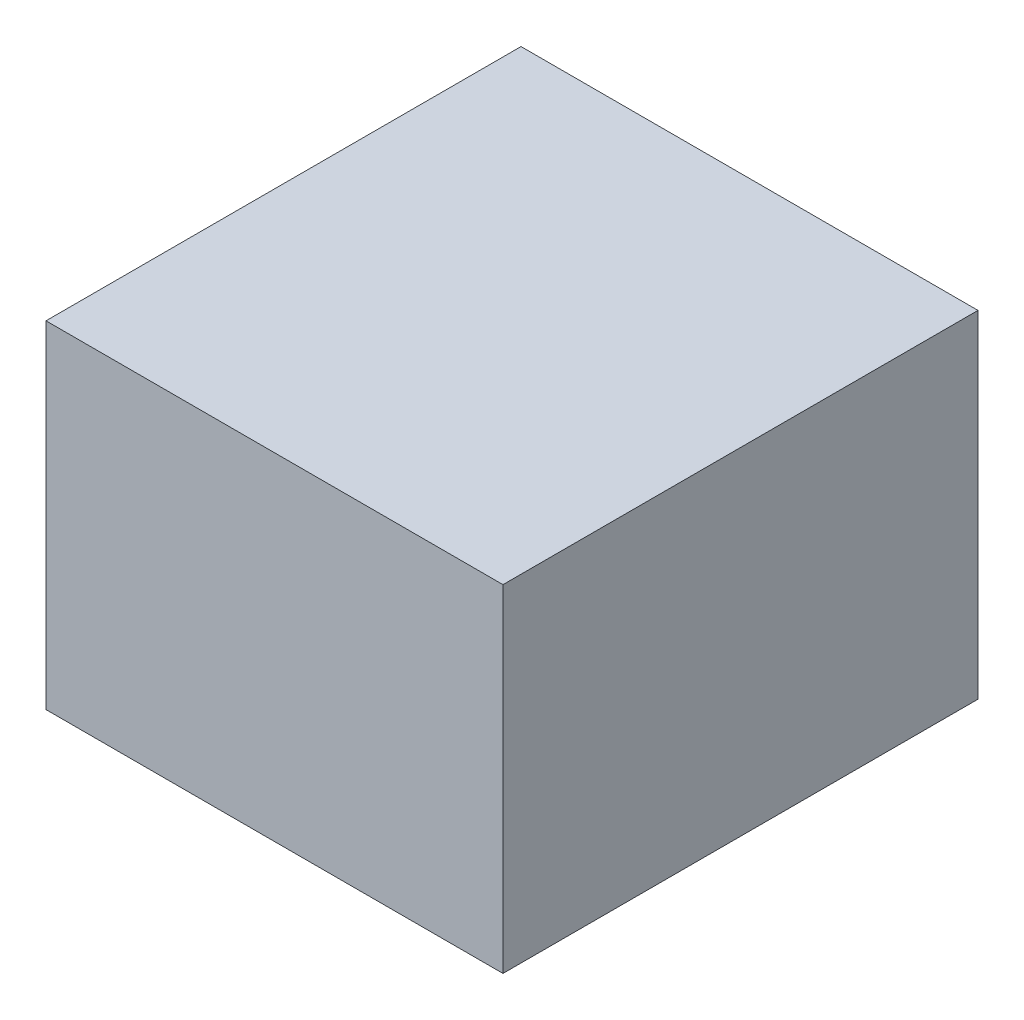
ISO-10303-21;
HEADER;
FILE_DESCRIPTION(('STEP AP214'),'2;1');
FILE_NAME('part.step','',(''),(''),'','','');
FILE_SCHEMA(('AUTOMOTIVE_DESIGN { 1 0 10303 214 1 1 1 1 }'));
ENDSEC;
DATA;
#1=APPLICATION_CONTEXT('core data for automotive mechanical design processes');
#2=APPLICATION_PROTOCOL_DEFINITION('international standard','automotive_design',2000,#1);
#3=PRODUCT_CONTEXT('',#1,'mechanical');
#4=PRODUCT('Part','Part','',(#3));
#5=PRODUCT_RELATED_PRODUCT_CATEGORY('part','',(#4));
#6=PRODUCT_DEFINITION_FORMATION('','',#4);
#7=PRODUCT_DEFINITION_CONTEXT('part definition',#1,'design');
#8=PRODUCT_DEFINITION('design','',#6,#7);
#9=PRODUCT_DEFINITION_SHAPE('','',#8);
#10=(LENGTH_UNIT() NAMED_UNIT(*) SI_UNIT(.MILLI.,.METRE.));
#11=(NAMED_UNIT(*) PLANE_ANGLE_UNIT() SI_UNIT($,.RADIAN.));
#12=(NAMED_UNIT(*) SI_UNIT($,.STERADIAN.) SOLID_ANGLE_UNIT());
#13=UNCERTAINTY_MEASURE_WITH_UNIT(LENGTH_MEASURE(1.E-05),#10,'distance_accuracy_value','');
#14=(GEOMETRIC_REPRESENTATION_CONTEXT(3) GLOBAL_UNCERTAINTY_ASSIGNED_CONTEXT((#13)) GLOBAL_UNIT_ASSIGNED_CONTEXT((#10,
#11,#12)) REPRESENTATION_CONTEXT('',''));
#15=CARTESIAN_POINT('',(0.,0.,0.));
#16=DIRECTION('',(0.,0.,1.));
#17=DIRECTION('',(1.,0.,0.));
#18=AXIS2_PLACEMENT_3D('',#15,#16,#17);
#19=CARTESIAN_POINT('',(3.8,5.6,3.95));
#20=DIRECTION('',(-1.,0.,0.));
#21=DIRECTION('',(0.,0.,1.));
#22=AXIS2_PLACEMENT_3D('',#19,#20,#21);
#23=PLANE('',#22);
#24=DIRECTION('',(0.,0.,-1.));
#25=VECTOR('',#24,1.);
#26=CARTESIAN_POINT('',(3.8,0.,3.95));
#27=LINE('',#26,#25);
#28=CARTESIAN_POINT('',(3.8,0.,3.95));
#29=VERTEX_POINT('',#28);
#30=CARTESIAN_POINT('',(3.8,0.,-3.95));
#31=VERTEX_POINT('',#30);
#32=EDGE_CURVE('E141',#29,#31,#27,.T.);
#33=ORIENTED_EDGE('',*,*,#32,.T.);
#34=DIRECTION('',(0.,-1.,0.));
#35=VECTOR('',#34,1.);
#36=CARTESIAN_POINT('',(3.8,5.6,-3.95));
#37=LINE('',#36,#35);
#38=CARTESIAN_POINT('',(3.8,5.6,-3.95));
#39=VERTEX_POINT('',#38);
#40=EDGE_CURVE('E11',#39,#31,#37,.T.);
#41=ORIENTED_EDGE('',*,*,#40,.F.);
#42=DIRECTION('',(0.,0.,-1.));
#43=VECTOR('',#42,1.);
#44=CARTESIAN_POINT('',(3.8,5.6,3.95));
#45=LINE('',#44,#43);
#46=CARTESIAN_POINT('',(3.8,5.6,3.95));
#47=VERTEX_POINT('',#46);
#48=EDGE_CURVE('E145',#47,#39,#45,.T.);
#49=ORIENTED_EDGE('',*,*,#48,.F.);
#50=DIRECTION('',(0.,-1.,0.));
#51=VECTOR('',#50,1.);
#52=CARTESIAN_POINT('',(3.8,5.6,3.95));
#53=LINE('',#52,#51);
#54=EDGE_CURVE('E151',#47,#29,#53,.T.);
#55=ORIENTED_EDGE('',*,*,#54,.T.);
#56=EDGE_LOOP('',(#33,#41,#49,#55));
#57=FACE_BOUND('',#56,.T.);
#58=ADVANCED_FACE('F33',(#57),#23,.F.);
#59=CARTESIAN_POINT('',(-3.8,5.6,-3.95));
#60=DIRECTION('',(0.,0.,1.));
#61=DIRECTION('',(1.,0.,0.));
#62=AXIS2_PLACEMENT_3D('',#59,#60,#61);
#63=PLANE('',#62);
#64=DIRECTION('',(-1.,0.,0.));
#65=VECTOR('',#64,1.);
#66=CARTESIAN_POINT('',(-3.8,0.,-3.95));
#67=LINE('',#66,#65);
#68=CARTESIAN_POINT('',(-3.8,0.,-3.95));
#69=VERTEX_POINT('',#68);
#70=EDGE_CURVE('E154',#31,#69,#67,.T.);
#71=ORIENTED_EDGE('',*,*,#70,.T.);
#72=DIRECTION('',(0.,-1.,0.));
#73=VECTOR('',#72,1.);
#74=CARTESIAN_POINT('',(-3.8,5.6,-3.95));
#75=LINE('',#74,#73);
#76=CARTESIAN_POINT('',(-3.8,5.6,-3.95));
#77=VERTEX_POINT('',#76);
#78=EDGE_CURVE('E40',#77,#69,#75,.T.);
#79=ORIENTED_EDGE('',*,*,#78,.F.);
#80=DIRECTION('',(-1.,0.,0.));
#81=VECTOR('',#80,1.);
#82=CARTESIAN_POINT('',(-3.8,5.6,-3.95));
#83=LINE('',#82,#81);
#84=EDGE_CURVE('E84',#39,#77,#83,.T.);
#85=ORIENTED_EDGE('',*,*,#84,.F.);
#86=ORIENTED_EDGE('',*,*,#40,.T.);
#87=EDGE_LOOP('',(#71,#79,#85,#86));
#88=FACE_BOUND('',#87,.T.);
#89=ADVANCED_FACE('F182',(#88),#63,.F.);
#90=CARTESIAN_POINT('',(-3.8,5.6,3.95));
#91=DIRECTION('',(1.,0.,0.));
#92=DIRECTION('',(0.,0.,-1.));
#93=AXIS2_PLACEMENT_3D('',#90,#91,#92);
#94=PLANE('',#93);
#95=DIRECTION('',(0.,0.,1.));
#96=VECTOR('',#95,1.);
#97=CARTESIAN_POINT('',(-3.8,0.8,-2.35));
#98=LINE('',#97,#96);
#99=CARTESIAN_POINT('',(-3.8,0.8,-2.35));
#100=VERTEX_POINT('',#99);
#101=CARTESIAN_POINT('',(-3.8,0.800000000000002,2.35));
#102=VERTEX_POINT('',#101);
#103=EDGE_CURVE('E135',#100,#102,#98,.T.);
#104=ORIENTED_EDGE('',*,*,#103,.F.);
#105=DIRECTION('',(0.,-1.,0.));
#106=VECTOR('',#105,1.);
#107=CARTESIAN_POINT('',(-3.8,4.8,-2.35));
#108=LINE('',#107,#106);
#109=CARTESIAN_POINT('',(-3.8,4.8,-2.35));
#110=VERTEX_POINT('',#109);
#111=EDGE_CURVE('E47',#110,#100,#108,.T.);
#112=ORIENTED_EDGE('',*,*,#111,.F.);
#113=DIRECTION('',(0.,0.,-1.));
#114=VECTOR('',#113,1.);
#115=CARTESIAN_POINT('',(-3.8,4.8,-2.35));
#116=LINE('',#115,#114);
#117=CARTESIAN_POINT('',(-3.8,4.8,2.35));
#118=VERTEX_POINT('',#117);
#119=EDGE_CURVE('E126',#118,#110,#116,.T.);
#120=ORIENTED_EDGE('',*,*,#119,.F.);
#121=DIRECTION('',(0.,1.,0.));
#122=VECTOR('',#121,1.);
#123=CARTESIAN_POINT('',(-3.8,4.8,2.35));
#124=LINE('',#123,#122);
#125=EDGE_CURVE('E129',#102,#118,#124,.T.);
#126=ORIENTED_EDGE('',*,*,#125,.F.);
#127=EDGE_LOOP('',(#104,#112,#120,#126));
#128=FACE_BOUND('',#127,.T.);
#129=DIRECTION('',(0.,0.,1.));
#130=VECTOR('',#129,1.);
#131=CARTESIAN_POINT('',(-3.8,0.,3.95));
#132=LINE('',#131,#130);
#133=CARTESIAN_POINT('',(-3.8,0.,3.95));
#134=VERTEX_POINT('',#133);
#135=EDGE_CURVE('E156',#69,#134,#132,.T.);
#136=ORIENTED_EDGE('',*,*,#135,.T.);
#137=DIRECTION('',(0.,-1.,0.));
#138=VECTOR('',#137,1.);
#139=CARTESIAN_POINT('',(-3.8,5.6,3.95));
#140=LINE('',#139,#138);
#141=CARTESIAN_POINT('',(-3.8,5.6,3.95));
#142=VERTEX_POINT('',#141);
#143=EDGE_CURVE('E160',#142,#134,#140,.T.);
#144=ORIENTED_EDGE('',*,*,#143,.F.);
#145=DIRECTION('',(0.,0.,1.));
#146=VECTOR('',#145,1.);
#147=CARTESIAN_POINT('',(-3.8,5.6,3.95));
#148=LINE('',#147,#146);
#149=EDGE_CURVE('E148',#77,#142,#148,.T.);
#150=ORIENTED_EDGE('',*,*,#149,.F.);
#151=ORIENTED_EDGE('',*,*,#78,.T.);
#152=EDGE_LOOP('',(#136,#144,#150,#151));
#153=FACE_BOUND('',#152,.T.);
#154=ADVANCED_FACE('F165',(#128,#153),#94,.F.);
#155=CARTESIAN_POINT('',(-3.8,5.6,3.95));
#156=DIRECTION('',(0.,0.,-1.));
#157=DIRECTION('',(-1.,0.,0.));
#158=AXIS2_PLACEMENT_3D('',#155,#156,#157);
#159=PLANE('',#158);
#160=DIRECTION('',(1.,0.,0.));
#161=VECTOR('',#160,1.);
#162=CARTESIAN_POINT('',(-3.8,0.,3.95));
#163=LINE('',#162,#161);
#164=EDGE_CURVE('E77',#134,#29,#163,.T.);
#165=ORIENTED_EDGE('',*,*,#164,.T.);
#166=ORIENTED_EDGE('',*,*,#54,.F.);
#167=DIRECTION('',(1.,0.,0.));
#168=VECTOR('',#167,1.);
#169=CARTESIAN_POINT('',(-3.8,5.6,3.95));
#170=LINE('',#169,#168);
#171=EDGE_CURVE('E56',#142,#47,#170,.T.);
#172=ORIENTED_EDGE('',*,*,#171,.F.);
#173=ORIENTED_EDGE('',*,*,#143,.T.);
#174=EDGE_LOOP('',(#165,#166,#172,#173));
#175=FACE_BOUND('',#174,.T.);
#176=ADVANCED_FACE('F173',(#175),#159,.F.);
#177=CARTESIAN_POINT('',(0.,5.6,0.));
#178=DIRECTION('',(0.,-1.,0.));
#179=DIRECTION('',(0.,0.,-1.));
#180=AXIS2_PLACEMENT_3D('',#177,#178,#179);
#181=PLANE('',#180);
#182=ORIENTED_EDGE('',*,*,#48,.T.);
#183=ORIENTED_EDGE('',*,*,#84,.T.);
#184=ORIENTED_EDGE('',*,*,#149,.T.);
#185=ORIENTED_EDGE('',*,*,#171,.T.);
#186=EDGE_LOOP('',(#182,#183,#184,#185));
#187=FACE_BOUND('',#186,.T.);
#188=ADVANCED_FACE('F175',(#187),#181,.F.);
#189=CARTESIAN_POINT('',(0.,0.,0.));
#190=DIRECTION('',(0.,-1.,0.));
#191=DIRECTION('',(0.,0.,-1.));
#192=AXIS2_PLACEMENT_3D('',#189,#190,#191);
#193=PLANE('',#192);
#194=ORIENTED_EDGE('',*,*,#32,.F.);
#195=ORIENTED_EDGE('',*,*,#164,.F.);
#196=ORIENTED_EDGE('',*,*,#135,.F.);
#197=ORIENTED_EDGE('',*,*,#70,.F.);
#198=EDGE_LOOP('',(#194,#195,#196,#197));
#199=FACE_BOUND('',#198,.T.);
#200=ADVANCED_FACE('F169',(#199),#193,.T.);
#201=CARTESIAN_POINT('',(0.699999999999999,4.8,-2.35));
#202=DIRECTION('',(0.,0.,-1.));
#203=DIRECTION('',(0.,1.,0.));
#204=AXIS2_PLACEMENT_3D('',#201,#202,#203);
#205=PLANE('',#204);
#206=ORIENTED_EDGE('',*,*,#111,.T.);
#207=DIRECTION('',(-1.,0.,0.));
#208=VECTOR('',#207,1.);
#209=CARTESIAN_POINT('',(0.699999999999999,0.8,-2.35));
#210=LINE('',#209,#208);
#211=CARTESIAN_POINT('',(0.699999999999999,0.8,-2.35));
#212=VERTEX_POINT('',#211);
#213=EDGE_CURVE('E104',#212,#100,#210,.T.);
#214=ORIENTED_EDGE('',*,*,#213,.F.);
#215=DIRECTION('',(0.,-1.,0.));
#216=VECTOR('',#215,1.);
#217=CARTESIAN_POINT('',(0.699999999999999,4.8,-2.35));
#218=LINE('',#217,#216);
#219=CARTESIAN_POINT('',(0.699999999999999,4.8,-2.35));
#220=VERTEX_POINT('',#219);
#221=EDGE_CURVE('E108',#220,#212,#218,.T.);
#222=ORIENTED_EDGE('',*,*,#221,.F.);
#223=DIRECTION('',(-1.,0.,0.));
#224=VECTOR('',#223,1.);
#225=CARTESIAN_POINT('',(0.699999999999999,4.8,-2.35));
#226=LINE('',#225,#224);
#227=EDGE_CURVE('E139',#220,#110,#226,.T.);
#228=ORIENTED_EDGE('',*,*,#227,.T.);
#229=EDGE_LOOP('',(#206,#214,#222,#228));
#230=FACE_BOUND('',#229,.T.);
#231=ADVANCED_FACE('F106',(#230),#205,.F.);
#232=CARTESIAN_POINT('',(0.699999999999999,4.8,-2.35));
#233=DIRECTION('',(0.,1.,0.));
#234=DIRECTION('',(0.,0.,1.));
#235=AXIS2_PLACEMENT_3D('',#232,#233,#234);
#236=PLANE('',#235);
#237=ORIENTED_EDGE('',*,*,#119,.T.);
#238=ORIENTED_EDGE('',*,*,#227,.F.);
#239=DIRECTION('',(0.,0.,-1.));
#240=VECTOR('',#239,1.);
#241=CARTESIAN_POINT('',(0.699999999999999,4.8,-2.35));
#242=LINE('',#241,#240);
#243=CARTESIAN_POINT('',(0.699999999999999,4.8,2.35));
#244=VERTEX_POINT('',#243);
#245=EDGE_CURVE('E114',#244,#220,#242,.T.);
#246=ORIENTED_EDGE('',*,*,#245,.F.);
#247=DIRECTION('',(-1.,0.,0.));
#248=VECTOR('',#247,1.);
#249=CARTESIAN_POINT('',(0.699999999999999,4.8,2.35));
#250=LINE('',#249,#248);
#251=EDGE_CURVE('E142',#244,#118,#250,.T.);
#252=ORIENTED_EDGE('',*,*,#251,.T.);
#253=EDGE_LOOP('',(#237,#238,#246,#252));
#254=FACE_BOUND('',#253,.T.);
#255=ADVANCED_FACE('F211',(#254),#236,.F.);
#256=CARTESIAN_POINT('',(0.699999999999999,4.8,2.35));
#257=DIRECTION('',(0.,0.,1.));
#258=DIRECTION('',(0.,-1.,0.));
#259=AXIS2_PLACEMENT_3D('',#256,#257,#258);
#260=PLANE('',#259);
#261=ORIENTED_EDGE('',*,*,#125,.T.);
#262=ORIENTED_EDGE('',*,*,#251,.F.);
#263=DIRECTION('',(0.,1.,0.));
#264=VECTOR('',#263,1.);
#265=CARTESIAN_POINT('',(0.699999999999999,4.8,2.35));
#266=LINE('',#265,#264);
#267=CARTESIAN_POINT('',(0.699999999999999,0.800000000000002,2.35));
#268=VERTEX_POINT('',#267);
#269=EDGE_CURVE('E122',#268,#244,#266,.T.);
#270=ORIENTED_EDGE('',*,*,#269,.F.);
#271=DIRECTION('',(-1.,0.,0.));
#272=VECTOR('',#271,1.);
#273=CARTESIAN_POINT('',(0.699999999999999,0.800000000000002,2.35));
#274=LINE('',#273,#272);
#275=EDGE_CURVE('E113',#268,#102,#274,.T.);
#276=ORIENTED_EDGE('',*,*,#275,.T.);
#277=EDGE_LOOP('',(#261,#262,#270,#276));
#278=FACE_BOUND('',#277,.T.);
#279=ADVANCED_FACE('F220',(#278),#260,.F.);
#280=CARTESIAN_POINT('',(0.699999999999999,0.8,-2.35));
#281=DIRECTION('',(0.,-1.,0.));
#282=DIRECTION('',(0.,0.,-1.));
#283=AXIS2_PLACEMENT_3D('',#280,#281,#282);
#284=PLANE('',#283);
#285=ORIENTED_EDGE('',*,*,#103,.T.);
#286=ORIENTED_EDGE('',*,*,#275,.F.);
#287=DIRECTION('',(0.,0.,1.));
#288=VECTOR('',#287,1.);
#289=CARTESIAN_POINT('',(0.699999999999999,0.8,-2.35));
#290=LINE('',#289,#288);
#291=EDGE_CURVE('E117',#212,#268,#290,.T.);
#292=ORIENTED_EDGE('',*,*,#291,.F.);
#293=ORIENTED_EDGE('',*,*,#213,.T.);
#294=EDGE_LOOP('',(#285,#286,#292,#293));
#295=FACE_BOUND('',#294,.T.);
#296=ADVANCED_FACE('F118',(#295),#284,.F.);
#297=CARTESIAN_POINT('',(0.699999999999999,0.,0.));
#298=DIRECTION('',(-1.,0.,0.));
#299=DIRECTION('',(0.,0.,1.));
#300=AXIS2_PLACEMENT_3D('',#297,#298,#299);
#301=PLANE('',#300);
#302=ORIENTED_EDGE('',*,*,#221,.T.);
#303=ORIENTED_EDGE('',*,*,#291,.T.);
#304=ORIENTED_EDGE('',*,*,#269,.T.);
#305=ORIENTED_EDGE('',*,*,#245,.T.);
#306=EDGE_LOOP('',(#302,#303,#304,#305));
#307=FACE_BOUND('',#306,.T.);
#308=ADVANCED_FACE('F124',(#307),#301,.T.);
#309=CLOSED_SHELL('',(#58,#89,#154,#176,#188,#200,#231,#255,#279,#296,#308));
#310=MANIFOLD_SOLID_BREP('B2',#309);
#311=ADVANCED_BREP_SHAPE_REPRESENTATION('',(#18,#310),#14);
#312=SHAPE_DEFINITION_REPRESENTATION(#9,#311);
ENDSEC;
END-ISO-10303-21;
